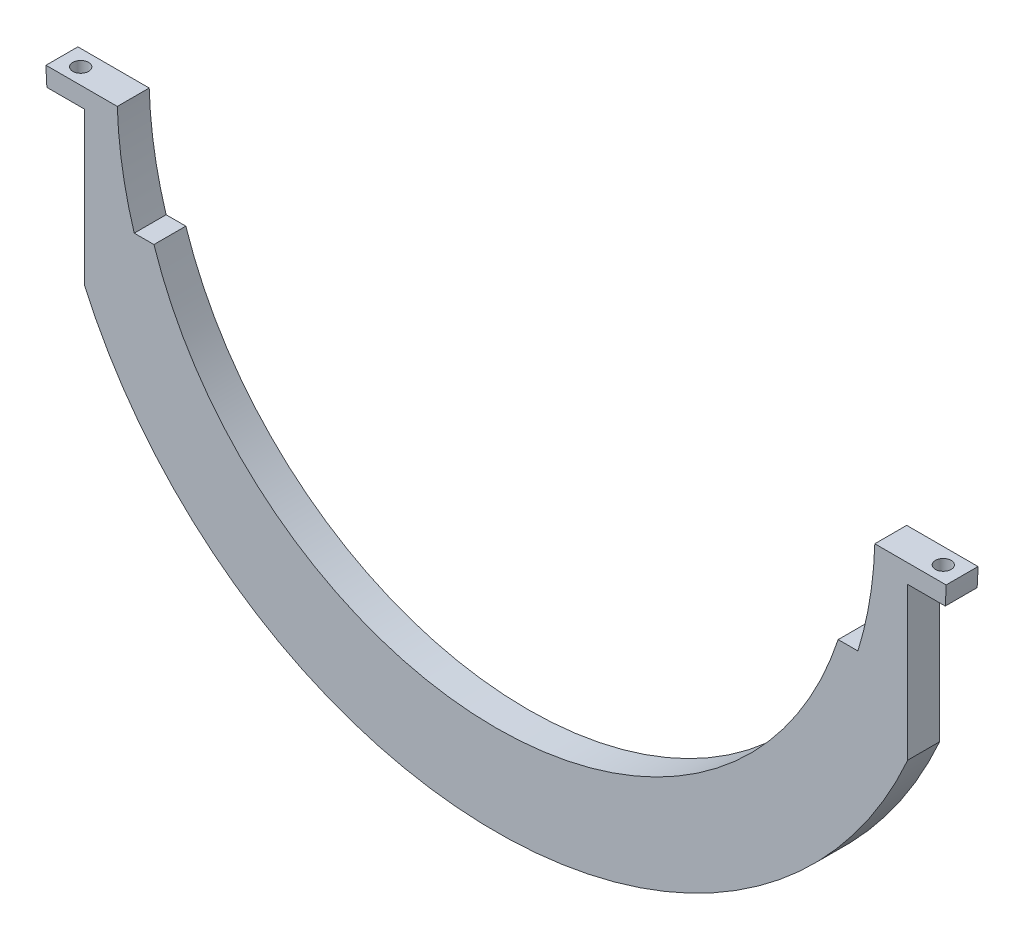
ISO-10303-21;
HEADER;
FILE_DESCRIPTION(('STEP AP214'),'2;1');
FILE_NAME('part.step','',(''),(''),'','','');
FILE_SCHEMA(('AUTOMOTIVE_DESIGN { 1 0 10303 214 1 1 1 1 }'));
ENDSEC;
DATA;
#1=APPLICATION_CONTEXT('core data for automotive mechanical design processes');
#2=APPLICATION_PROTOCOL_DEFINITION('international standard','automotive_design',2000,#1);
#3=PRODUCT_CONTEXT('',#1,'mechanical');
#4=PRODUCT('Part','Part','',(#3));
#5=PRODUCT_RELATED_PRODUCT_CATEGORY('part','',(#4));
#6=PRODUCT_DEFINITION_FORMATION('','',#4);
#7=PRODUCT_DEFINITION_CONTEXT('part definition',#1,'design');
#8=PRODUCT_DEFINITION('design','',#6,#7);
#9=PRODUCT_DEFINITION_SHAPE('','',#8);
#10=(LENGTH_UNIT() NAMED_UNIT(*) SI_UNIT(.MILLI.,.METRE.));
#11=(NAMED_UNIT(*) PLANE_ANGLE_UNIT() SI_UNIT($,.RADIAN.));
#12=(NAMED_UNIT(*) SI_UNIT($,.STERADIAN.) SOLID_ANGLE_UNIT());
#13=UNCERTAINTY_MEASURE_WITH_UNIT(LENGTH_MEASURE(1.E-05),#10,'distance_accuracy_value','');
#14=(GEOMETRIC_REPRESENTATION_CONTEXT(3) GLOBAL_UNCERTAINTY_ASSIGNED_CONTEXT((#13)) GLOBAL_UNIT_ASSIGNED_CONTEXT((#10,
#11,#12)) REPRESENTATION_CONTEXT('',''));
#15=CARTESIAN_POINT('',(0.,0.,0.));
#16=DIRECTION('',(0.,0.,1.));
#17=DIRECTION('',(1.,0.,0.));
#18=AXIS2_PLACEMENT_3D('',#15,#16,#17);
#19=CARTESIAN_POINT('',(0.,0.,8.5));
#20=DIRECTION('',(0.,0.,-1.));
#21=DIRECTION('',(-1.,0.,0.));
#22=AXIS2_PLACEMENT_3D('',#19,#20,#21);
#23=CYLINDRICAL_SURFACE('',#22,120.);
#24=CARTESIAN_POINT('',(0.,0.,0.));
#25=DIRECTION('',(0.,0.,1.));
#26=DIRECTION('',(1.,0.,0.));
#27=AXIS2_PLACEMENT_3D('',#24,#25,#26);
#28=CIRCLE('',#27,120.);
#29=CARTESIAN_POINT('',(119.733036376766,-7.99999999999997,0.));
#30=VERTEX_POINT('',#29);
#31=CARTESIAN_POINT('',(119.962494138793,-3.,0.));
#32=VERTEX_POINT('',#31);
#33=EDGE_CURVE('E166',#30,#32,#28,.T.);
#34=ORIENTED_EDGE('',*,*,#33,.T.);
#35=DIRECTION('',(0.,0.,-1.));
#36=VECTOR('',#35,1.);
#37=CARTESIAN_POINT('',(119.962494138793,-3.,8.5));
#38=LINE('',#37,#36);
#39=CARTESIAN_POINT('',(119.962494138793,-3.,8.5));
#40=VERTEX_POINT('',#39);
#41=EDGE_CURVE('E11',#40,#32,#38,.T.);
#42=ORIENTED_EDGE('',*,*,#41,.F.);
#43=CARTESIAN_POINT('',(0.,0.,8.5));
#44=DIRECTION('',(0.,0.,1.));
#45=DIRECTION('',(1.,0.,0.));
#46=AXIS2_PLACEMENT_3D('',#43,#44,#45);
#47=CIRCLE('',#46,120.);
#48=CARTESIAN_POINT('',(119.733036376766,-7.99999999999997,8.5));
#49=VERTEX_POINT('',#48);
#50=EDGE_CURVE('E193',#49,#40,#47,.T.);
#51=ORIENTED_EDGE('',*,*,#50,.F.);
#52=DIRECTION('',(0.,0.,-1.));
#53=VECTOR('',#52,1.);
#54=CARTESIAN_POINT('',(119.733036376766,-7.99999999999997,8.5));
#55=LINE('',#54,#53);
#56=EDGE_CURVE('E162',#49,#30,#55,.T.);
#57=ORIENTED_EDGE('',*,*,#56,.T.);
#58=EDGE_LOOP('',(#34,#42,#51,#57));
#59=FACE_BOUND('',#58,.T.);
#60=ADVANCED_FACE('F32',(#59),#23,.T.);
#61=CARTESIAN_POINT('',(100.955435712992,-3.,8.5));
#62=DIRECTION('',(0.,-1.,0.));
#63=DIRECTION('',(0.,0.,-1.));
#64=AXIS2_PLACEMENT_3D('',#61,#62,#63);
#65=PLANE('',#64);
#66=CARTESIAN_POINT('',(114.962494138793,-3.,4.25));
#67=DIRECTION('',(0.,1.,0.));
#68=DIRECTION('',(0.,0.,1.));
#69=AXIS2_PLACEMENT_3D('',#66,#67,#68);
#70=CIRCLE('',#69,2.1);
#71=CARTESIAN_POINT('',(114.962494138793,-3.,6.35));
#72=VERTEX_POINT('',#71);
#73=EDGE_CURVE('E231',#72,#72,#70,.T.);
#74=ORIENTED_EDGE('',*,*,#73,.F.);
#75=EDGE_LOOP('',(#74));
#76=FACE_BOUND('',#75,.T.);
#77=DIRECTION('',(-1.,0.,0.));
#78=VECTOR('',#77,1.);
#79=CARTESIAN_POINT('',(100.955435712992,-3.,0.));
#80=LINE('',#79,#78);
#81=CARTESIAN_POINT('',(100.955435712992,-2.99999999999998,0.));
#82=VERTEX_POINT('',#81);
#83=EDGE_CURVE('E169',#32,#82,#80,.T.);
#84=ORIENTED_EDGE('',*,*,#83,.T.);
#85=DIRECTION('',(0.,0.,-1.));
#86=VECTOR('',#85,1.);
#87=CARTESIAN_POINT('',(100.955435712992,-2.99999999999998,8.5));
#88=LINE('',#87,#86);
#89=CARTESIAN_POINT('',(100.955435712992,-2.99999999999998,8.5));
#90=VERTEX_POINT('',#89);
#91=EDGE_CURVE('E41',#90,#82,#88,.T.);
#92=ORIENTED_EDGE('',*,*,#91,.F.);
#93=DIRECTION('',(-1.,0.,0.));
#94=VECTOR('',#93,1.);
#95=CARTESIAN_POINT('',(100.955435712992,-3.,8.5));
#96=LINE('',#95,#94);
#97=EDGE_CURVE('E111',#40,#90,#96,.T.);
#98=ORIENTED_EDGE('',*,*,#97,.F.);
#99=ORIENTED_EDGE('',*,*,#41,.T.);
#100=EDGE_LOOP('',(#84,#92,#98,#99));
#101=FACE_BOUND('',#100,.T.);
#102=ADVANCED_FACE('F280',(#76,#101),#65,.F.);
#103=CARTESIAN_POINT('',(0.,0.,8.5));
#104=DIRECTION('',(0.,0.,-1.));
#105=DIRECTION('',(-1.,0.,0.));
#106=AXIS2_PLACEMENT_3D('',#103,#104,#105);
#107=CYLINDRICAL_SURFACE('',#106,101.);
#108=CARTESIAN_POINT('',(0.,0.,0.));
#109=DIRECTION('',(0.,0.,-1.));
#110=DIRECTION('',(1.,0.,0.));
#111=AXIS2_PLACEMENT_3D('',#108,#109,#110);
#112=CIRCLE('',#111,101.);
#113=CARTESIAN_POINT('',(96.4416922290355,-30.,0.));
#114=VERTEX_POINT('',#113);
#115=EDGE_CURVE('E172',#82,#114,#112,.T.);
#116=ORIENTED_EDGE('',*,*,#115,.T.);
#117=DIRECTION('',(0.,0.,-1.));
#118=VECTOR('',#117,1.);
#119=CARTESIAN_POINT('',(96.4416922290355,-30.,8.5));
#120=LINE('',#119,#118);
#121=CARTESIAN_POINT('',(96.4416922290355,-30.,8.5));
#122=VERTEX_POINT('',#121);
#123=EDGE_CURVE('E218',#122,#114,#120,.T.);
#124=ORIENTED_EDGE('',*,*,#123,.F.);
#125=CARTESIAN_POINT('',(0.,0.,8.5));
#126=DIRECTION('',(0.,0.,-1.));
#127=DIRECTION('',(1.,0.,0.));
#128=AXIS2_PLACEMENT_3D('',#125,#126,#127);
#129=CIRCLE('',#128,101.);
#130=EDGE_CURVE('E236',#90,#122,#129,.T.);
#131=ORIENTED_EDGE('',*,*,#130,.F.);
#132=ORIENTED_EDGE('',*,*,#91,.T.);
#133=EDGE_LOOP('',(#116,#124,#131,#132));
#134=FACE_BOUND('',#133,.T.);
#135=ADVANCED_FACE('F284',(#134),#107,.F.);
#136=CARTESIAN_POINT('',(91.192104921424,-30.,8.5));
#137=DIRECTION('',(0.,-1.,0.));
#138=DIRECTION('',(1.,0.,0.));
#139=AXIS2_PLACEMENT_3D('',#136,#137,#138);
#140=PLANE('',#139);
#141=DIRECTION('',(-1.,0.,0.));
#142=VECTOR('',#141,1.);
#143=CARTESIAN_POINT('',(91.192104921424,-30.,0.));
#144=LINE('',#143,#142);
#145=CARTESIAN_POINT('',(91.192104921424,-30.,0.));
#146=VERTEX_POINT('',#145);
#147=EDGE_CURVE('E174',#114,#146,#144,.T.);
#148=ORIENTED_EDGE('',*,*,#147,.T.);
#149=DIRECTION('',(0.,0.,-1.));
#150=VECTOR('',#149,1.);
#151=CARTESIAN_POINT('',(91.192104921424,-30.,8.5));
#152=LINE('',#151,#150);
#153=CARTESIAN_POINT('',(91.192104921424,-30.,8.5));
#154=VERTEX_POINT('',#153);
#155=EDGE_CURVE('E215',#154,#146,#152,.T.);
#156=ORIENTED_EDGE('',*,*,#155,.F.);
#157=DIRECTION('',(-1.,0.,0.));
#158=VECTOR('',#157,1.);
#159=CARTESIAN_POINT('',(91.192104921424,-30.,8.5));
#160=LINE('',#159,#158);
#161=EDGE_CURVE('E238',#122,#154,#160,.T.);
#162=ORIENTED_EDGE('',*,*,#161,.F.);
#163=ORIENTED_EDGE('',*,*,#123,.T.);
#164=EDGE_LOOP('',(#148,#156,#162,#163));
#165=FACE_BOUND('',#164,.T.);
#166=ADVANCED_FACE('F289',(#165),#140,.F.);
#167=CARTESIAN_POINT('',(0.,0.,8.5));
#168=DIRECTION('',(0.,0.,-1.));
#169=DIRECTION('',(-1.,0.,0.));
#170=AXIS2_PLACEMENT_3D('',#167,#168,#169);
#171=CYLINDRICAL_SURFACE('',#170,96.);
#172=CARTESIAN_POINT('',(0.,0.,0.));
#173=DIRECTION('',(0.,0.,-1.));
#174=DIRECTION('',(1.,0.,0.));
#175=AXIS2_PLACEMENT_3D('',#172,#173,#174);
#176=CIRCLE('',#175,96.);
#177=CARTESIAN_POINT('',(-91.192104921424,-30.,0.));
#178=VERTEX_POINT('',#177);
#179=EDGE_CURVE('E176',#146,#178,#176,.T.);
#180=ORIENTED_EDGE('',*,*,#179,.T.);
#181=DIRECTION('',(0.,0.,-1.));
#182=VECTOR('',#181,1.);
#183=CARTESIAN_POINT('',(-91.192104921424,-30.,8.5));
#184=LINE('',#183,#182);
#185=CARTESIAN_POINT('',(-91.192104921424,-30.,8.5));
#186=VERTEX_POINT('',#185);
#187=EDGE_CURVE('E212',#186,#178,#184,.T.);
#188=ORIENTED_EDGE('',*,*,#187,.F.);
#189=CARTESIAN_POINT('',(0.,0.,8.5));
#190=DIRECTION('',(0.,0.,-1.));
#191=DIRECTION('',(1.,0.,0.));
#192=AXIS2_PLACEMENT_3D('',#189,#190,#191);
#193=CIRCLE('',#192,96.);
#194=EDGE_CURVE('E240',#154,#186,#193,.T.);
#195=ORIENTED_EDGE('',*,*,#194,.F.);
#196=ORIENTED_EDGE('',*,*,#155,.T.);
#197=EDGE_LOOP('',(#180,#188,#195,#196));
#198=FACE_BOUND('',#197,.T.);
#199=ADVANCED_FACE('F296',(#198),#171,.F.);
#200=CARTESIAN_POINT('',(-96.4416922290355,-30.,8.5));
#201=DIRECTION('',(0.,-1.,0.));
#202=DIRECTION('',(1.,0.,0.));
#203=AXIS2_PLACEMENT_3D('',#200,#201,#202);
#204=PLANE('',#203);
#205=DIRECTION('',(-1.,0.,0.));
#206=VECTOR('',#205,1.);
#207=CARTESIAN_POINT('',(-96.4416922290355,-30.,0.));
#208=LINE('',#207,#206);
#209=CARTESIAN_POINT('',(-96.4416922290355,-30.,0.));
#210=VERTEX_POINT('',#209);
#211=EDGE_CURVE('E178',#178,#210,#208,.T.);
#212=ORIENTED_EDGE('',*,*,#211,.T.);
#213=DIRECTION('',(0.,0.,-1.));
#214=VECTOR('',#213,1.);
#215=CARTESIAN_POINT('',(-96.4416922290355,-30.,8.5));
#216=LINE('',#215,#214);
#217=CARTESIAN_POINT('',(-96.4416922290355,-30.,8.5));
#218=VERTEX_POINT('',#217);
#219=EDGE_CURVE('E209',#218,#210,#216,.T.);
#220=ORIENTED_EDGE('',*,*,#219,.F.);
#221=DIRECTION('',(-1.,0.,0.));
#222=VECTOR('',#221,1.);
#223=CARTESIAN_POINT('',(-96.4416922290355,-30.,8.5));
#224=LINE('',#223,#222);
#225=EDGE_CURVE('E242',#186,#218,#224,.T.);
#226=ORIENTED_EDGE('',*,*,#225,.F.);
#227=ORIENTED_EDGE('',*,*,#187,.T.);
#228=EDGE_LOOP('',(#212,#220,#226,#227));
#229=FACE_BOUND('',#228,.T.);
#230=ADVANCED_FACE('F300',(#229),#204,.F.);
#231=CARTESIAN_POINT('',(0.,0.,8.5));
#232=DIRECTION('',(0.,0.,-1.));
#233=DIRECTION('',(-1.,0.,0.));
#234=AXIS2_PLACEMENT_3D('',#231,#232,#233);
#235=CYLINDRICAL_SURFACE('',#234,101.);
#236=CARTESIAN_POINT('',(0.,0.,0.));
#237=DIRECTION('',(0.,0.,-1.));
#238=DIRECTION('',(1.,0.,0.));
#239=AXIS2_PLACEMENT_3D('',#236,#237,#238);
#240=CIRCLE('',#239,101.);
#241=CARTESIAN_POINT('',(-100.955435712992,-3.,0.));
#242=VERTEX_POINT('',#241);
#243=EDGE_CURVE('E180',#210,#242,#240,.T.);
#244=ORIENTED_EDGE('',*,*,#243,.T.);
#245=DIRECTION('',(0.,0.,-1.));
#246=VECTOR('',#245,1.);
#247=CARTESIAN_POINT('',(-100.955435712992,-3.,8.5));
#248=LINE('',#247,#246);
#249=CARTESIAN_POINT('',(-100.955435712992,-3.,8.5));
#250=VERTEX_POINT('',#249);
#251=EDGE_CURVE('E206',#250,#242,#248,.T.);
#252=ORIENTED_EDGE('',*,*,#251,.F.);
#253=CARTESIAN_POINT('',(0.,0.,8.5));
#254=DIRECTION('',(0.,0.,-1.));
#255=DIRECTION('',(1.,0.,0.));
#256=AXIS2_PLACEMENT_3D('',#253,#254,#255);
#257=CIRCLE('',#256,101.);
#258=EDGE_CURVE('E244',#218,#250,#257,.T.);
#259=ORIENTED_EDGE('',*,*,#258,.F.);
#260=ORIENTED_EDGE('',*,*,#219,.T.);
#261=EDGE_LOOP('',(#244,#252,#259,#260));
#262=FACE_BOUND('',#261,.T.);
#263=ADVANCED_FACE('F304',(#262),#235,.F.);
#264=CARTESIAN_POINT('',(-119.962494138793,-3.,8.5));
#265=DIRECTION('',(0.,-1.,0.));
#266=DIRECTION('',(0.,0.,-1.));
#267=AXIS2_PLACEMENT_3D('',#264,#265,#266);
#268=PLANE('',#267);
#269=CARTESIAN_POINT('',(-114.962494138793,-3.,4.25));
#270=DIRECTION('',(0.,1.,0.));
#271=DIRECTION('',(0.,0.,1.));
#272=AXIS2_PLACEMENT_3D('',#269,#270,#271);
#273=CIRCLE('',#272,2.1);
#274=CARTESIAN_POINT('',(-114.962494138793,-3.,6.35));
#275=VERTEX_POINT('',#274);
#276=EDGE_CURVE('E223',#275,#275,#273,.T.);
#277=ORIENTED_EDGE('',*,*,#276,.F.);
#278=EDGE_LOOP('',(#277));
#279=FACE_BOUND('',#278,.T.);
#280=DIRECTION('',(-1.,0.,0.));
#281=VECTOR('',#280,1.);
#282=CARTESIAN_POINT('',(-119.962494138793,-3.,0.));
#283=LINE('',#282,#281);
#284=CARTESIAN_POINT('',(-119.962494138793,-2.99999999999997,0.));
#285=VERTEX_POINT('',#284);
#286=EDGE_CURVE('E182',#242,#285,#283,.T.);
#287=ORIENTED_EDGE('',*,*,#286,.T.);
#288=DIRECTION('',(0.,0.,-1.));
#289=VECTOR('',#288,1.);
#290=CARTESIAN_POINT('',(-119.962494138793,-2.99999999999997,8.5));
#291=LINE('',#290,#289);
#292=CARTESIAN_POINT('',(-119.962494138793,-2.99999999999997,8.5));
#293=VERTEX_POINT('',#292);
#294=EDGE_CURVE('E203',#293,#285,#291,.T.);
#295=ORIENTED_EDGE('',*,*,#294,.F.);
#296=DIRECTION('',(-1.,0.,0.));
#297=VECTOR('',#296,1.);
#298=CARTESIAN_POINT('',(-119.962494138793,-3.,8.5));
#299=LINE('',#298,#297);
#300=EDGE_CURVE('E246',#250,#293,#299,.T.);
#301=ORIENTED_EDGE('',*,*,#300,.F.);
#302=ORIENTED_EDGE('',*,*,#251,.T.);
#303=EDGE_LOOP('',(#287,#295,#301,#302));
#304=FACE_BOUND('',#303,.T.);
#305=ADVANCED_FACE('F308',(#279,#304),#268,.F.);
#306=CARTESIAN_POINT('',(0.,0.,8.5));
#307=DIRECTION('',(0.,0.,-1.));
#308=DIRECTION('',(-1.,0.,0.));
#309=AXIS2_PLACEMENT_3D('',#306,#307,#308);
#310=CYLINDRICAL_SURFACE('',#309,120.);
#311=CARTESIAN_POINT('',(0.,0.,0.));
#312=DIRECTION('',(0.,0.,1.));
#313=DIRECTION('',(1.,0.,0.));
#314=AXIS2_PLACEMENT_3D('',#311,#312,#313);
#315=CIRCLE('',#314,120.);
#316=CARTESIAN_POINT('',(-119.733036376766,-8.,0.));
#317=VERTEX_POINT('',#316);
#318=EDGE_CURVE('E184',#285,#317,#315,.T.);
#319=ORIENTED_EDGE('',*,*,#318,.T.);
#320=DIRECTION('',(0.,0.,-1.));
#321=VECTOR('',#320,1.);
#322=CARTESIAN_POINT('',(-119.733036376766,-8.,8.5));
#323=LINE('',#322,#321);
#324=CARTESIAN_POINT('',(-119.733036376766,-8.,8.5));
#325=VERTEX_POINT('',#324);
#326=EDGE_CURVE('E200',#325,#317,#323,.T.);
#327=ORIENTED_EDGE('',*,*,#326,.F.);
#328=CARTESIAN_POINT('',(0.,0.,8.5));
#329=DIRECTION('',(0.,0.,1.));
#330=DIRECTION('',(1.,0.,0.));
#331=AXIS2_PLACEMENT_3D('',#328,#329,#330);
#332=CIRCLE('',#331,120.);
#333=EDGE_CURVE('E248',#293,#325,#332,.T.);
#334=ORIENTED_EDGE('',*,*,#333,.F.);
#335=ORIENTED_EDGE('',*,*,#294,.T.);
#336=EDGE_LOOP('',(#319,#327,#334,#335));
#337=FACE_BOUND('',#336,.T.);
#338=ADVANCED_FACE('F312',(#337),#310,.T.);
#339=CARTESIAN_POINT('',(-119.733036376766,-8.,8.5));
#340=DIRECTION('',(0.,1.,0.));
#341=DIRECTION('',(0.,0.,1.));
#342=AXIS2_PLACEMENT_3D('',#339,#340,#341);
#343=PLANE('',#342);
#344=CARTESIAN_POINT('',(-114.962494138793,-8.,4.25));
#345=DIRECTION('',(0.,1.,0.));
#346=DIRECTION('',(0.,0.,1.));
#347=AXIS2_PLACEMENT_3D('',#344,#345,#346);
#348=CIRCLE('',#347,2.1);
#349=CARTESIAN_POINT('',(-114.962494138793,-8.,6.35));
#350=VERTEX_POINT('',#349);
#351=EDGE_CURVE('E170',#350,#350,#348,.T.);
#352=ORIENTED_EDGE('',*,*,#351,.T.);
#353=EDGE_LOOP('',(#352));
#354=FACE_BOUND('',#353,.T.);
#355=DIRECTION('',(1.,0.,0.));
#356=VECTOR('',#355,1.);
#357=CARTESIAN_POINT('',(-119.733036376766,-8.,0.));
#358=LINE('',#357,#356);
#359=CARTESIAN_POINT('',(-109.733036376766,-8.,0.));
#360=VERTEX_POINT('',#359);
#361=EDGE_CURVE('E186',#317,#360,#358,.T.);
#362=ORIENTED_EDGE('',*,*,#361,.T.);
#363=DIRECTION('',(0.,0.,-1.));
#364=VECTOR('',#363,1.);
#365=CARTESIAN_POINT('',(-109.733036376766,-8.,8.5));
#366=LINE('',#365,#364);
#367=CARTESIAN_POINT('',(-109.733036376766,-8.,8.5));
#368=VERTEX_POINT('',#367);
#369=EDGE_CURVE('E197',#368,#360,#366,.T.);
#370=ORIENTED_EDGE('',*,*,#369,.F.);
#371=DIRECTION('',(1.,0.,0.));
#372=VECTOR('',#371,1.);
#373=CARTESIAN_POINT('',(-119.733036376766,-8.,8.5));
#374=LINE('',#373,#372);
#375=EDGE_CURVE('E250',#325,#368,#374,.T.);
#376=ORIENTED_EDGE('',*,*,#375,.F.);
#377=ORIENTED_EDGE('',*,*,#326,.T.);
#378=EDGE_LOOP('',(#362,#370,#376,#377));
#379=FACE_BOUND('',#378,.T.);
#380=ADVANCED_FACE('F256',(#354,#379),#343,.F.);
#381=CARTESIAN_POINT('',(-109.733036376766,-8.,8.5));
#382=DIRECTION('',(1.,0.,0.));
#383=DIRECTION('',(0.,0.,-1.));
#384=AXIS2_PLACEMENT_3D('',#381,#382,#383);
#385=PLANE('',#384);
#386=DIRECTION('',(0.,-1.,0.));
#387=VECTOR('',#386,1.);
#388=CARTESIAN_POINT('',(-109.733036376766,-8.,0.));
#389=LINE('',#388,#387);
#390=CARTESIAN_POINT('',(-109.733036376766,-48.5660450061081,0.));
#391=VERTEX_POINT('',#390);
#392=EDGE_CURVE('E188',#360,#391,#389,.T.);
#393=ORIENTED_EDGE('',*,*,#392,.T.);
#394=DIRECTION('',(0.,0.,-1.));
#395=VECTOR('',#394,1.);
#396=CARTESIAN_POINT('',(-109.733036376766,-48.5660450061081,8.5));
#397=LINE('',#396,#395);
#398=CARTESIAN_POINT('',(-109.733036376766,-48.5660450061081,8.5));
#399=VERTEX_POINT('',#398);
#400=EDGE_CURVE('E157',#399,#391,#397,.T.);
#401=ORIENTED_EDGE('',*,*,#400,.F.);
#402=DIRECTION('',(0.,-1.,0.));
#403=VECTOR('',#402,1.);
#404=CARTESIAN_POINT('',(-109.733036376766,-8.,8.5));
#405=LINE('',#404,#403);
#406=EDGE_CURVE('E148',#368,#399,#405,.T.);
#407=ORIENTED_EDGE('',*,*,#406,.F.);
#408=ORIENTED_EDGE('',*,*,#369,.T.);
#409=EDGE_LOOP('',(#393,#401,#407,#408));
#410=FACE_BOUND('',#409,.T.);
#411=ADVANCED_FACE('F260',(#410),#385,.F.);
#412=CARTESIAN_POINT('',(0.,0.,8.5));
#413=DIRECTION('',(0.,0.,-1.));
#414=DIRECTION('',(-1.,0.,0.));
#415=AXIS2_PLACEMENT_3D('',#412,#413,#414);
#416=CYLINDRICAL_SURFACE('',#415,120.);
#417=CARTESIAN_POINT('',(0.,0.,0.));
#418=DIRECTION('',(0.,0.,1.));
#419=DIRECTION('',(1.,0.,0.));
#420=AXIS2_PLACEMENT_3D('',#417,#418,#419);
#421=CIRCLE('',#420,120.);
#422=CARTESIAN_POINT('',(109.733036376766,-48.5660450061081,0.));
#423=VERTEX_POINT('',#422);
#424=EDGE_CURVE('E156',#391,#423,#421,.T.);
#425=ORIENTED_EDGE('',*,*,#424,.T.);
#426=DIRECTION('',(0.,0.,-1.));
#427=VECTOR('',#426,1.);
#428=CARTESIAN_POINT('',(109.733036376766,-48.5660450061081,8.5));
#429=LINE('',#428,#427);
#430=CARTESIAN_POINT('',(109.733036376766,-48.5660450061081,8.5));
#431=VERTEX_POINT('',#430);
#432=EDGE_CURVE('E153',#431,#423,#429,.T.);
#433=ORIENTED_EDGE('',*,*,#432,.F.);
#434=CARTESIAN_POINT('',(0.,0.,8.5));
#435=DIRECTION('',(0.,0.,1.));
#436=DIRECTION('',(1.,0.,0.));
#437=AXIS2_PLACEMENT_3D('',#434,#435,#436);
#438=CIRCLE('',#437,120.);
#439=EDGE_CURVE('E142',#399,#431,#438,.T.);
#440=ORIENTED_EDGE('',*,*,#439,.F.);
#441=ORIENTED_EDGE('',*,*,#400,.T.);
#442=EDGE_LOOP('',(#425,#433,#440,#441));
#443=FACE_BOUND('',#442,.T.);
#444=ADVANCED_FACE('F154',(#443),#416,.T.);
#445=CARTESIAN_POINT('',(109.733036376766,-7.99999999999997,8.5));
#446=DIRECTION('',(-1.,0.,0.));
#447=DIRECTION('',(0.,0.,1.));
#448=AXIS2_PLACEMENT_3D('',#445,#446,#447);
#449=PLANE('',#448);
#450=DIRECTION('',(0.,1.,0.));
#451=VECTOR('',#450,1.);
#452=CARTESIAN_POINT('',(109.733036376766,-7.99999999999997,0.));
#453=LINE('',#452,#451);
#454=CARTESIAN_POINT('',(109.733036376766,-7.99999999999997,0.));
#455=VERTEX_POINT('',#454);
#456=EDGE_CURVE('E97',#423,#455,#453,.T.);
#457=ORIENTED_EDGE('',*,*,#456,.T.);
#458=DIRECTION('',(0.,0.,-1.));
#459=VECTOR('',#458,1.);
#460=CARTESIAN_POINT('',(109.733036376766,-7.99999999999997,8.5));
#461=LINE('',#460,#459);
#462=CARTESIAN_POINT('',(109.733036376766,-7.99999999999997,8.5));
#463=VERTEX_POINT('',#462);
#464=EDGE_CURVE('E158',#463,#455,#461,.T.);
#465=ORIENTED_EDGE('',*,*,#464,.F.);
#466=DIRECTION('',(0.,1.,0.));
#467=VECTOR('',#466,1.);
#468=CARTESIAN_POINT('',(109.733036376766,-7.99999999999997,8.5));
#469=LINE('',#468,#467);
#470=EDGE_CURVE('E146',#431,#463,#469,.T.);
#471=ORIENTED_EDGE('',*,*,#470,.F.);
#472=ORIENTED_EDGE('',*,*,#432,.T.);
#473=EDGE_LOOP('',(#457,#465,#471,#472));
#474=FACE_BOUND('',#473,.T.);
#475=ADVANCED_FACE('F160',(#474),#449,.F.);
#476=CARTESIAN_POINT('',(119.733036376766,-7.99999999999997,8.5));
#477=DIRECTION('',(0.,1.,0.));
#478=DIRECTION('',(-1.,0.,0.));
#479=AXIS2_PLACEMENT_3D('',#476,#477,#478);
#480=PLANE('',#479);
#481=CARTESIAN_POINT('',(114.962494138793,-7.99999999999997,4.25));
#482=DIRECTION('',(0.,1.,0.));
#483=DIRECTION('',(-1.,0.,0.));
#484=AXIS2_PLACEMENT_3D('',#481,#482,#483);
#485=CIRCLE('',#484,2.1);
#486=CARTESIAN_POINT('',(112.862494138793,-7.99999999999997,4.25));
#487=VERTEX_POINT('',#486);
#488=EDGE_CURVE('E35',#487,#487,#485,.T.);
#489=ORIENTED_EDGE('',*,*,#488,.T.);
#490=EDGE_LOOP('',(#489));
#491=FACE_BOUND('',#490,.T.);
#492=DIRECTION('',(1.,0.,0.));
#493=VECTOR('',#492,1.);
#494=CARTESIAN_POINT('',(119.733036376766,-7.99999999999997,0.));
#495=LINE('',#494,#493);
#496=EDGE_CURVE('E103',#455,#30,#495,.T.);
#497=ORIENTED_EDGE('',*,*,#496,.T.);
#498=ORIENTED_EDGE('',*,*,#56,.F.);
#499=DIRECTION('',(1.,0.,0.));
#500=VECTOR('',#499,1.);
#501=CARTESIAN_POINT('',(119.733036376766,-7.99999999999997,8.5));
#502=LINE('',#501,#500);
#503=EDGE_CURVE('E50',#463,#49,#502,.T.);
#504=ORIENTED_EDGE('',*,*,#503,.F.);
#505=ORIENTED_EDGE('',*,*,#464,.T.);
#506=EDGE_LOOP('',(#497,#498,#504,#505));
#507=FACE_BOUND('',#506,.T.);
#508=ADVANCED_FACE('F268',(#491,#507),#480,.F.);
#509=CARTESIAN_POINT('',(0.,0.,8.5));
#510=DIRECTION('',(0.,0.,1.));
#511=DIRECTION('',(1.,0.,0.));
#512=AXIS2_PLACEMENT_3D('',#509,#510,#511);
#513=PLANE('',#512);
#514=ORIENTED_EDGE('',*,*,#50,.T.);
#515=ORIENTED_EDGE('',*,*,#97,.T.);
#516=ORIENTED_EDGE('',*,*,#130,.T.);
#517=ORIENTED_EDGE('',*,*,#161,.T.);
#518=ORIENTED_EDGE('',*,*,#194,.T.);
#519=ORIENTED_EDGE('',*,*,#225,.T.);
#520=ORIENTED_EDGE('',*,*,#258,.T.);
#521=ORIENTED_EDGE('',*,*,#300,.T.);
#522=ORIENTED_EDGE('',*,*,#333,.T.);
#523=ORIENTED_EDGE('',*,*,#375,.T.);
#524=ORIENTED_EDGE('',*,*,#406,.T.);
#525=ORIENTED_EDGE('',*,*,#439,.T.);
#526=ORIENTED_EDGE('',*,*,#470,.T.);
#527=ORIENTED_EDGE('',*,*,#503,.T.);
#528=EDGE_LOOP('',(#514,#515,#516,#517,#518,#519,#520,#521,#522,#523,#524,#525,#526,#527));
#529=FACE_BOUND('',#528,.T.);
#530=ADVANCED_FACE('F144',(#529),#513,.T.);
#531=CARTESIAN_POINT('',(0.,0.,0.));
#532=DIRECTION('',(0.,0.,1.));
#533=DIRECTION('',(1.,0.,0.));
#534=AXIS2_PLACEMENT_3D('',#531,#532,#533);
#535=PLANE('',#534);
#536=ORIENTED_EDGE('',*,*,#33,.F.);
#537=ORIENTED_EDGE('',*,*,#496,.F.);
#538=ORIENTED_EDGE('',*,*,#456,.F.);
#539=ORIENTED_EDGE('',*,*,#424,.F.);
#540=ORIENTED_EDGE('',*,*,#392,.F.);
#541=ORIENTED_EDGE('',*,*,#361,.F.);
#542=ORIENTED_EDGE('',*,*,#318,.F.);
#543=ORIENTED_EDGE('',*,*,#286,.F.);
#544=ORIENTED_EDGE('',*,*,#243,.F.);
#545=ORIENTED_EDGE('',*,*,#211,.F.);
#546=ORIENTED_EDGE('',*,*,#179,.F.);
#547=ORIENTED_EDGE('',*,*,#147,.F.);
#548=ORIENTED_EDGE('',*,*,#115,.F.);
#549=ORIENTED_EDGE('',*,*,#83,.F.);
#550=EDGE_LOOP('',(#536,#537,#538,#539,#540,#541,#542,#543,#544,#545,#546,#547,#548,#549));
#551=FACE_BOUND('',#550,.T.);
#552=ADVANCED_FACE('F263',(#551),#535,.F.);
#553=CARTESIAN_POINT('',(-114.962494138793,-13.,4.25));
#554=DIRECTION('',(0.,1.,0.));
#555=DIRECTION('',(0.,0.,1.));
#556=AXIS2_PLACEMENT_3D('',#553,#554,#555);
#557=CYLINDRICAL_SURFACE('',#556,2.1);
#558=ORIENTED_EDGE('',*,*,#276,.T.);
#559=EDGE_LOOP('',(#558));
#560=FACE_BOUND('',#559,.T.);
#561=ORIENTED_EDGE('',*,*,#351,.F.);
#562=EDGE_LOOP('',(#561));
#563=FACE_BOUND('',#562,.T.);
#564=ADVANCED_FACE('F345',(#560,#563),#557,.F.);
#565=CARTESIAN_POINT('',(114.962494138793,-13.,4.25));
#566=DIRECTION('',(0.,1.,0.));
#567=DIRECTION('',(0.,0.,1.));
#568=AXIS2_PLACEMENT_3D('',#565,#566,#567);
#569=CYLINDRICAL_SURFACE('',#568,2.1);
#570=ORIENTED_EDGE('',*,*,#73,.T.);
#571=EDGE_LOOP('',(#570));
#572=FACE_BOUND('',#571,.T.);
#573=ORIENTED_EDGE('',*,*,#488,.F.);
#574=EDGE_LOOP('',(#573));
#575=FACE_BOUND('',#574,.T.);
#576=ADVANCED_FACE('F378',(#572,#575),#569,.F.);
#577=CLOSED_SHELL('',(#60,#102,#135,#166,#199,#230,#263,#305,#338,#380,#411,#444,#475,#508,#530,
#552,#564,#576));
#578=MANIFOLD_SOLID_BREP('B2',#577);
#579=ADVANCED_BREP_SHAPE_REPRESENTATION('',(#18,#578),#14);
#580=SHAPE_DEFINITION_REPRESENTATION(#9,#579);
ENDSEC;
END-ISO-10303-21;
